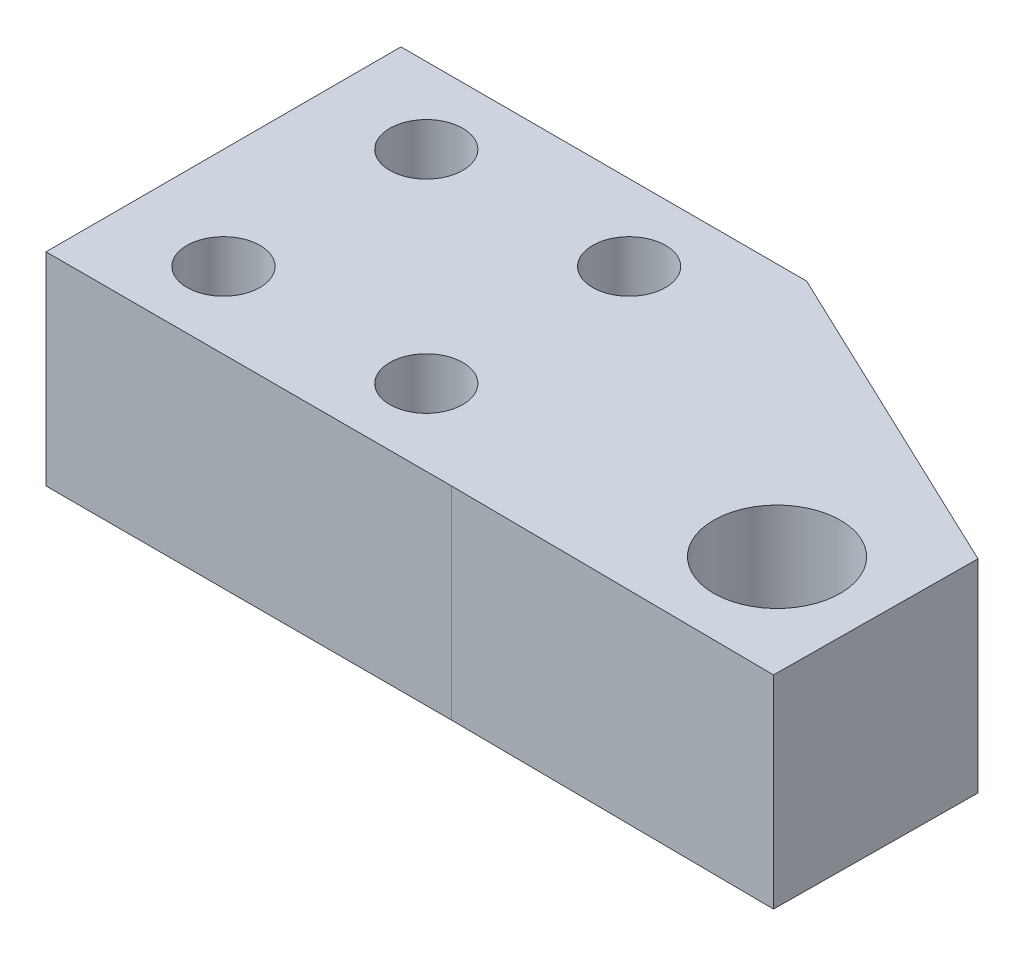
ISO-10303-21;
HEADER;
FILE_DESCRIPTION(('STEP AP214'),'2;1');
FILE_NAME('part.step','',(''),(''),'','','');
FILE_SCHEMA(('AUTOMOTIVE_DESIGN { 1 0 10303 214 1 1 1 1 }'));
ENDSEC;
DATA;
#1=APPLICATION_CONTEXT('core data for automotive mechanical design processes');
#2=APPLICATION_PROTOCOL_DEFINITION('international standard','automotive_design',2000,#1);
#3=PRODUCT_CONTEXT('',#1,'mechanical');
#4=PRODUCT('Part','Part','',(#3));
#5=PRODUCT_RELATED_PRODUCT_CATEGORY('part','',(#4));
#6=PRODUCT_DEFINITION_FORMATION('','',#4);
#7=PRODUCT_DEFINITION_CONTEXT('part definition',#1,'design');
#8=PRODUCT_DEFINITION('design','',#6,#7);
#9=PRODUCT_DEFINITION_SHAPE('','',#8);
#10=(LENGTH_UNIT() NAMED_UNIT(*) SI_UNIT(.MILLI.,.METRE.));
#11=(NAMED_UNIT(*) PLANE_ANGLE_UNIT() SI_UNIT($,.RADIAN.));
#12=(NAMED_UNIT(*) SI_UNIT($,.STERADIAN.) SOLID_ANGLE_UNIT());
#13=UNCERTAINTY_MEASURE_WITH_UNIT(LENGTH_MEASURE(1.E-05),#10,'distance_accuracy_value','');
#14=(GEOMETRIC_REPRESENTATION_CONTEXT(3) GLOBAL_UNCERTAINTY_ASSIGNED_CONTEXT((#13)) GLOBAL_UNIT_ASSIGNED_CONTEXT((#10,
#11,#12)) REPRESENTATION_CONTEXT('',''));
#15=CARTESIAN_POINT('',(0.,0.,0.));
#16=DIRECTION('',(0.,0.,1.));
#17=DIRECTION('',(1.,0.,0.));
#18=AXIS2_PLACEMENT_3D('',#15,#16,#17);
#19=CARTESIAN_POINT('',(0.,6.35,0.));
#20=DIRECTION('',(0.,1.,0.));
#21=DIRECTION('',(0.,0.,1.));
#22=AXIS2_PLACEMENT_3D('',#19,#20,#21);
#23=PLANE('',#22);
#24=CARTESIAN_POINT('',(19.05,6.35,-17.4625));
#25=DIRECTION('',(0.,1.,0.));
#26=DIRECTION('',(0.,0.,1.));
#27=AXIS2_PLACEMENT_3D('',#24,#25,#26);
#28=CIRCLE('',#27,2.286);
#29=CARTESIAN_POINT('',(19.05,6.35,-15.1765));
#30=VERTEX_POINT('',#29);
#31=EDGE_CURVE('E220',#30,#30,#28,.T.);
#32=ORIENTED_EDGE('',*,*,#31,.F.);
#33=EDGE_LOOP('',(#32));
#34=FACE_BOUND('',#33,.T.);
#35=CARTESIAN_POINT('',(19.05,6.35,-4.7625));
#36=DIRECTION('',(0.,1.,0.));
#37=DIRECTION('',(0.,0.,1.));
#38=AXIS2_PLACEMENT_3D('',#35,#36,#37);
#39=CIRCLE('',#38,2.286);
#40=CARTESIAN_POINT('',(19.05,6.35,-2.4765));
#41=VERTEX_POINT('',#40);
#42=EDGE_CURVE('E236',#41,#41,#39,.T.);
#43=ORIENTED_EDGE('',*,*,#42,.F.);
#44=EDGE_LOOP('',(#43));
#45=FACE_BOUND('',#44,.T.);
#46=DIRECTION('',(1.,0.,0.));
#47=VECTOR('',#46,1.);
#48=CARTESIAN_POINT('',(0.,6.35,0.));
#49=LINE('',#48,#47);
#50=CARTESIAN_POINT('',(0.,6.35,0.));
#51=VERTEX_POINT('',#50);
#52=CARTESIAN_POINT('',(25.4,6.35,0.));
#53=VERTEX_POINT('',#52);
#54=EDGE_CURVE('E150',#51,#53,#49,.T.);
#55=ORIENTED_EDGE('',*,*,#54,.T.);
#56=DIRECTION('',(0.999966329518516,0.,0.0082060848927775));
#57=VECTOR('',#56,1.);
#58=CARTESIAN_POINT('',(25.4,6.35,0.));
#59=LINE('',#58,#57);
#60=CARTESIAN_POINT('',(45.7193158158162,6.35,0.166747645021239));
#61=VERTEX_POINT('',#60);
#62=EDGE_CURVE('E98',#53,#61,#59,.T.);
#63=ORIENTED_EDGE('',*,*,#62,.T.);
#64=DIRECTION('',(0.0082060848927785,0.,-0.999966329518516));
#65=VECTOR('',#64,1.);
#66=CARTESIAN_POINT('',(45.8235330939545,6.35,-12.5328247398639));
#67=LINE('',#66,#65);
#68=CARTESIAN_POINT('',(45.8235330939545,6.35,-12.5328247398639));
#69=VERTEX_POINT('',#68);
#70=EDGE_CURVE('E111',#61,#69,#67,.T.);
#71=ORIENTED_EDGE('',*,*,#70,.T.);
#72=DIRECTION('',(-0.903431788503055,0.,-0.428731855035489));
#73=VECTOR('',#72,1.);
#74=CARTESIAN_POINT('',(25.4,6.35,-22.225));
#75=LINE('',#74,#73);
#76=CARTESIAN_POINT('',(25.4,6.35,-22.225));
#77=VERTEX_POINT('',#76);
#78=EDGE_CURVE('E105',#69,#77,#75,.T.);
#79=ORIENTED_EDGE('',*,*,#78,.T.);
#80=DIRECTION('',(-1.,0.,0.));
#81=VECTOR('',#80,1.);
#82=CARTESIAN_POINT('',(0.,6.35,-22.225));
#83=LINE('',#82,#81);
#84=CARTESIAN_POINT('',(0.,6.35,-22.225));
#85=VERTEX_POINT('',#84);
#86=EDGE_CURVE('E109',#77,#85,#83,.T.);
#87=ORIENTED_EDGE('',*,*,#86,.T.);
#88=DIRECTION('',(0.,0.,1.));
#89=VECTOR('',#88,1.);
#90=CARTESIAN_POINT('',(0.,6.35,0.));
#91=LINE('',#90,#89);
#92=EDGE_CURVE('E61',#85,#51,#91,.T.);
#93=ORIENTED_EDGE('',*,*,#92,.T.);
#94=EDGE_LOOP('',(#55,#63,#71,#79,#87,#93));
#95=FACE_BOUND('',#94,.T.);
#96=CARTESIAN_POINT('',(39.4225807861159,6.35,-6.35));
#97=DIRECTION('',(0.,1.,0.));
#98=DIRECTION('',(0.,0.,1.));
#99=AXIS2_PLACEMENT_3D('',#96,#97,#98);
#100=CIRCLE('',#99,3.96875);
#101=CARTESIAN_POINT('',(39.4225807861159,6.35,-2.38125));
#102=VERTEX_POINT('',#101);
#103=EDGE_CURVE('E138',#102,#102,#100,.T.);
#104=ORIENTED_EDGE('',*,*,#103,.F.);
#105=EDGE_LOOP('',(#104));
#106=FACE_BOUND('',#105,.T.);
#107=CARTESIAN_POINT('',(6.35,6.35,-4.7625));
#108=DIRECTION('',(0.,1.,0.));
#109=DIRECTION('',(0.,0.,1.));
#110=AXIS2_PLACEMENT_3D('',#107,#108,#109);
#111=CIRCLE('',#110,2.286);
#112=CARTESIAN_POINT('',(6.35,6.35,-2.4765));
#113=VERTEX_POINT('',#112);
#114=EDGE_CURVE('E228',#113,#113,#111,.T.);
#115=ORIENTED_EDGE('',*,*,#114,.F.);
#116=EDGE_LOOP('',(#115));
#117=FACE_BOUND('',#116,.T.);
#118=CARTESIAN_POINT('',(6.34999999999996,6.35,-17.4625));
#119=DIRECTION('',(0.,1.,0.));
#120=DIRECTION('',(0.,0.,1.));
#121=AXIS2_PLACEMENT_3D('',#118,#119,#120);
#122=CIRCLE('',#121,2.286);
#123=CARTESIAN_POINT('',(6.34999999999996,6.35,-15.1765));
#124=VERTEX_POINT('',#123);
#125=EDGE_CURVE('E209',#124,#124,#122,.T.);
#126=ORIENTED_EDGE('',*,*,#125,.F.);
#127=EDGE_LOOP('',(#126));
#128=FACE_BOUND('',#127,.T.);
#129=ADVANCED_FACE('F43',(#34,#45,#95,#106,#117,#128),#23,.T.);
#130=CARTESIAN_POINT('',(0.,-6.35,0.));
#131=DIRECTION('',(0.,1.,0.));
#132=DIRECTION('',(0.,0.,1.));
#133=AXIS2_PLACEMENT_3D('',#130,#131,#132);
#134=PLANE('',#133);
#135=DIRECTION('',(1.,0.,0.));
#136=VECTOR('',#135,1.);
#137=CARTESIAN_POINT('',(0.,-6.35,0.));
#138=LINE('',#137,#136);
#139=CARTESIAN_POINT('',(0.,-6.35,0.));
#140=VERTEX_POINT('',#139);
#141=CARTESIAN_POINT('',(25.4,-6.35,0.));
#142=VERTEX_POINT('',#141);
#143=EDGE_CURVE('E133',#140,#142,#138,.T.);
#144=ORIENTED_EDGE('',*,*,#143,.F.);
#145=DIRECTION('',(0.,0.,1.));
#146=VECTOR('',#145,1.);
#147=CARTESIAN_POINT('',(0.,-6.35,0.));
#148=LINE('',#147,#146);
#149=CARTESIAN_POINT('',(0.,-6.35,-22.225));
#150=VERTEX_POINT('',#149);
#151=EDGE_CURVE('E90',#150,#140,#148,.T.);
#152=ORIENTED_EDGE('',*,*,#151,.F.);
#153=DIRECTION('',(-1.,0.,0.));
#154=VECTOR('',#153,1.);
#155=CARTESIAN_POINT('',(0.,-6.35,-22.225));
#156=LINE('',#155,#154);
#157=CARTESIAN_POINT('',(25.4,-6.35,-22.225));
#158=VERTEX_POINT('',#157);
#159=EDGE_CURVE('E84',#158,#150,#156,.T.);
#160=ORIENTED_EDGE('',*,*,#159,.F.);
#161=DIRECTION('',(-0.903431788503055,0.,-0.428731855035489));
#162=VECTOR('',#161,1.);
#163=CARTESIAN_POINT('',(25.4,-6.35,-22.225));
#164=LINE('',#163,#162);
#165=CARTESIAN_POINT('',(45.8235330939545,-6.35,-12.5328247398639));
#166=VERTEX_POINT('',#165);
#167=EDGE_CURVE('E120',#166,#158,#164,.T.);
#168=ORIENTED_EDGE('',*,*,#167,.F.);
#169=DIRECTION('',(0.0082060848927785,0.,-0.999966329518516));
#170=VECTOR('',#169,1.);
#171=CARTESIAN_POINT('',(45.8235330939545,-6.35,-12.5328247398639));
#172=LINE('',#171,#170);
#173=CARTESIAN_POINT('',(45.7193158158162,-6.35,0.166747645021239));
#174=VERTEX_POINT('',#173);
#175=EDGE_CURVE('E141',#174,#166,#172,.T.);
#176=ORIENTED_EDGE('',*,*,#175,.F.);
#177=DIRECTION('',(0.999966329518516,0.,0.0082060848927775));
#178=VECTOR('',#177,1.);
#179=CARTESIAN_POINT('',(25.4,-6.35,0.));
#180=LINE('',#179,#178);
#181=EDGE_CURVE('E137',#142,#174,#180,.T.);
#182=ORIENTED_EDGE('',*,*,#181,.F.);
#183=EDGE_LOOP('',(#144,#152,#160,#168,#176,#182));
#184=FACE_BOUND('',#183,.T.);
#185=CARTESIAN_POINT('',(39.4225807861159,-6.35,-6.35));
#186=DIRECTION('',(0.,1.,0.));
#187=DIRECTION('',(0.,0.,1.));
#188=AXIS2_PLACEMENT_3D('',#185,#186,#187);
#189=CIRCLE('',#188,3.96875);
#190=CARTESIAN_POINT('',(39.4225807861159,-6.35,-2.38125));
#191=VERTEX_POINT('',#190);
#192=EDGE_CURVE('E240',#191,#191,#189,.T.);
#193=ORIENTED_EDGE('',*,*,#192,.T.);
#194=EDGE_LOOP('',(#193));
#195=FACE_BOUND('',#194,.T.);
#196=CARTESIAN_POINT('',(19.05,-6.35,-4.7625));
#197=DIRECTION('',(0.,1.,0.));
#198=DIRECTION('',(0.,0.,1.));
#199=AXIS2_PLACEMENT_3D('',#196,#197,#198);
#200=CIRCLE('',#199,2.286);
#201=CARTESIAN_POINT('',(19.05,-6.35,-2.4765));
#202=VERTEX_POINT('',#201);
#203=EDGE_CURVE('E232',#202,#202,#200,.T.);
#204=ORIENTED_EDGE('',*,*,#203,.T.);
#205=EDGE_LOOP('',(#204));
#206=FACE_BOUND('',#205,.T.);
#207=CARTESIAN_POINT('',(6.35,-6.35,-4.7625));
#208=DIRECTION('',(0.,1.,0.));
#209=DIRECTION('',(0.,0.,1.));
#210=AXIS2_PLACEMENT_3D('',#207,#208,#209);
#211=CIRCLE('',#210,2.286);
#212=CARTESIAN_POINT('',(6.35,-6.35,-2.4765));
#213=VERTEX_POINT('',#212);
#214=EDGE_CURVE('E224',#213,#213,#211,.T.);
#215=ORIENTED_EDGE('',*,*,#214,.T.);
#216=EDGE_LOOP('',(#215));
#217=FACE_BOUND('',#216,.T.);
#218=CARTESIAN_POINT('',(19.05,-6.35,-17.4625));
#219=DIRECTION('',(0.,1.,0.));
#220=DIRECTION('',(0.,0.,1.));
#221=AXIS2_PLACEMENT_3D('',#218,#219,#220);
#222=CIRCLE('',#221,2.286);
#223=CARTESIAN_POINT('',(19.05,-6.35,-15.1765));
#224=VERTEX_POINT('',#223);
#225=EDGE_CURVE('E217',#224,#224,#222,.T.);
#226=ORIENTED_EDGE('',*,*,#225,.T.);
#227=EDGE_LOOP('',(#226));
#228=FACE_BOUND('',#227,.T.);
#229=CARTESIAN_POINT('',(6.34999999999996,-6.35,-17.4625));
#230=DIRECTION('',(0.,1.,0.));
#231=DIRECTION('',(0.,0.,1.));
#232=AXIS2_PLACEMENT_3D('',#229,#230,#231);
#233=CIRCLE('',#232,2.286);
#234=CARTESIAN_POINT('',(6.34999999999996,-6.35,-15.1765));
#235=VERTEX_POINT('',#234);
#236=EDGE_CURVE('E212',#235,#235,#233,.T.);
#237=ORIENTED_EDGE('',*,*,#236,.T.);
#238=EDGE_LOOP('',(#237));
#239=FACE_BOUND('',#238,.T.);
#240=ADVANCED_FACE('F163',(#184,#195,#206,#217,#228,#239),#134,.F.);
#241=CARTESIAN_POINT('',(0.,6.35,0.));
#242=DIRECTION('',(0.,0.,-1.));
#243=DIRECTION('',(-1.,0.,0.));
#244=AXIS2_PLACEMENT_3D('',#241,#242,#243);
#245=PLANE('',#244);
#246=ORIENTED_EDGE('',*,*,#143,.T.);
#247=DIRECTION('',(0.,-1.,0.));
#248=VECTOR('',#247,1.);
#249=CARTESIAN_POINT('',(25.4,6.35,0.));
#250=LINE('',#249,#248);
#251=EDGE_CURVE('E11',#53,#142,#250,.T.);
#252=ORIENTED_EDGE('',*,*,#251,.F.);
#253=ORIENTED_EDGE('',*,*,#54,.F.);
#254=DIRECTION('',(0.,-1.,0.));
#255=VECTOR('',#254,1.);
#256=CARTESIAN_POINT('',(0.,6.35,0.));
#257=LINE('',#256,#255);
#258=EDGE_CURVE('E129',#51,#140,#257,.T.);
#259=ORIENTED_EDGE('',*,*,#258,.T.);
#260=EDGE_LOOP('',(#246,#252,#253,#259));
#261=FACE_BOUND('',#260,.T.);
#262=ADVANCED_FACE('F45',(#261),#245,.F.);
#263=CARTESIAN_POINT('',(25.4,6.35,0.));
#264=DIRECTION('',(0.0082060848927775,0.,-0.999966329518516));
#265=DIRECTION('',(-0.999966329518516,0.,-0.0082060848927775));
#266=AXIS2_PLACEMENT_3D('',#263,#264,#265);
#267=PLANE('',#266);
#268=ORIENTED_EDGE('',*,*,#181,.T.);
#269=DIRECTION('',(0.,-1.,0.));
#270=VECTOR('',#269,1.);
#271=CARTESIAN_POINT('',(45.7193158158162,6.35,0.166747645021239));
#272=LINE('',#271,#270);
#273=EDGE_CURVE('E53',#61,#174,#272,.T.);
#274=ORIENTED_EDGE('',*,*,#273,.F.);
#275=ORIENTED_EDGE('',*,*,#62,.F.);
#276=ORIENTED_EDGE('',*,*,#251,.T.);
#277=EDGE_LOOP('',(#268,#274,#275,#276));
#278=FACE_BOUND('',#277,.T.);
#279=ADVANCED_FACE('F317',(#278),#267,.F.);
#280=CARTESIAN_POINT('',(45.8235330939545,6.35,-12.5328247398639));
#281=DIRECTION('',(-0.999966329518516,0.,-0.0082060848927785));
#282=DIRECTION('',(-0.0082060848927785,0.,0.999966329518516));
#283=AXIS2_PLACEMENT_3D('',#280,#281,#282);
#284=PLANE('',#283);
#285=ORIENTED_EDGE('',*,*,#175,.T.);
#286=DIRECTION('',(0.,-1.,0.));
#287=VECTOR('',#286,1.);
#288=CARTESIAN_POINT('',(45.8235330939545,6.35,-12.5328247398639));
#289=LINE('',#288,#287);
#290=EDGE_CURVE('E122',#69,#166,#289,.T.);
#291=ORIENTED_EDGE('',*,*,#290,.F.);
#292=ORIENTED_EDGE('',*,*,#70,.F.);
#293=ORIENTED_EDGE('',*,*,#273,.T.);
#294=EDGE_LOOP('',(#285,#291,#292,#293));
#295=FACE_BOUND('',#294,.T.);
#296=ADVANCED_FACE('F160',(#295),#284,.F.);
#297=CARTESIAN_POINT('',(25.4,6.35,-22.225));
#298=DIRECTION('',(-0.428731855035489,0.,0.903431788503055));
#299=DIRECTION('',(0.903431788503055,0.,0.428731855035489));
#300=AXIS2_PLACEMENT_3D('',#297,#298,#299);
#301=PLANE('',#300);
#302=ORIENTED_EDGE('',*,*,#167,.T.);
#303=DIRECTION('',(0.,-1.,0.));
#304=VECTOR('',#303,1.);
#305=CARTESIAN_POINT('',(25.4,6.35,-22.225));
#306=LINE('',#305,#304);
#307=EDGE_CURVE('E117',#77,#158,#306,.T.);
#308=ORIENTED_EDGE('',*,*,#307,.F.);
#309=ORIENTED_EDGE('',*,*,#78,.F.);
#310=ORIENTED_EDGE('',*,*,#290,.T.);
#311=EDGE_LOOP('',(#302,#308,#309,#310));
#312=FACE_BOUND('',#311,.T.);
#313=ADVANCED_FACE('F118',(#312),#301,.F.);
#314=CARTESIAN_POINT('',(0.,6.35,-22.225));
#315=DIRECTION('',(0.,0.,1.));
#316=DIRECTION('',(1.,0.,0.));
#317=AXIS2_PLACEMENT_3D('',#314,#315,#316);
#318=PLANE('',#317);
#319=ORIENTED_EDGE('',*,*,#159,.T.);
#320=DIRECTION('',(0.,-1.,0.));
#321=VECTOR('',#320,1.);
#322=CARTESIAN_POINT('',(0.,6.35,-22.225));
#323=LINE('',#322,#321);
#324=EDGE_CURVE('E123',#85,#150,#323,.T.);
#325=ORIENTED_EDGE('',*,*,#324,.F.);
#326=ORIENTED_EDGE('',*,*,#86,.F.);
#327=ORIENTED_EDGE('',*,*,#307,.T.);
#328=EDGE_LOOP('',(#319,#325,#326,#327));
#329=FACE_BOUND('',#328,.T.);
#330=ADVANCED_FACE('F125',(#329),#318,.F.);
#331=CARTESIAN_POINT('',(0.,6.35,0.));
#332=DIRECTION('',(1.,0.,0.));
#333=DIRECTION('',(0.,0.,-1.));
#334=AXIS2_PLACEMENT_3D('',#331,#332,#333);
#335=PLANE('',#334);
#336=ORIENTED_EDGE('',*,*,#151,.T.);
#337=ORIENTED_EDGE('',*,*,#258,.F.);
#338=ORIENTED_EDGE('',*,*,#92,.F.);
#339=ORIENTED_EDGE('',*,*,#324,.T.);
#340=EDGE_LOOP('',(#336,#337,#338,#339));
#341=FACE_BOUND('',#340,.T.);
#342=ADVANCED_FACE('F168',(#341),#335,.F.);
#343=CARTESIAN_POINT('',(39.4225807861159,6.35,-6.35));
#344=DIRECTION('',(0.,-1.,0.));
#345=DIRECTION('',(0.,0.,-1.));
#346=AXIS2_PLACEMENT_3D('',#343,#344,#345);
#347=CYLINDRICAL_SURFACE('',#346,3.96875);
#348=ORIENTED_EDGE('',*,*,#103,.T.);
#349=EDGE_LOOP('',(#348));
#350=FACE_BOUND('',#349,.T.);
#351=ORIENTED_EDGE('',*,*,#192,.F.);
#352=EDGE_LOOP('',(#351));
#353=FACE_BOUND('',#352,.T.);
#354=ADVANCED_FACE('F170',(#350,#353),#347,.F.);
#355=CARTESIAN_POINT('',(19.05,6.35,-4.7625));
#356=DIRECTION('',(0.,-1.,0.));
#357=DIRECTION('',(0.,0.,-1.));
#358=AXIS2_PLACEMENT_3D('',#355,#356,#357);
#359=CYLINDRICAL_SURFACE('',#358,2.286);
#360=ORIENTED_EDGE('',*,*,#42,.T.);
#361=EDGE_LOOP('',(#360));
#362=FACE_BOUND('',#361,.T.);
#363=ORIENTED_EDGE('',*,*,#203,.F.);
#364=EDGE_LOOP('',(#363));
#365=FACE_BOUND('',#364,.T.);
#366=ADVANCED_FACE('F176',(#362,#365),#359,.F.);
#367=CARTESIAN_POINT('',(6.35,6.35,-4.7625));
#368=DIRECTION('',(0.,-1.,0.));
#369=DIRECTION('',(0.,0.,-1.));
#370=AXIS2_PLACEMENT_3D('',#367,#368,#369);
#371=CYLINDRICAL_SURFACE('',#370,2.286);
#372=ORIENTED_EDGE('',*,*,#114,.T.);
#373=EDGE_LOOP('',(#372));
#374=FACE_BOUND('',#373,.T.);
#375=ORIENTED_EDGE('',*,*,#214,.F.);
#376=EDGE_LOOP('',(#375));
#377=FACE_BOUND('',#376,.T.);
#378=ADVANCED_FACE('F192',(#374,#377),#371,.F.);
#379=CARTESIAN_POINT('',(19.05,6.35,-17.4625));
#380=DIRECTION('',(0.,-1.,0.));
#381=DIRECTION('',(0.,0.,-1.));
#382=AXIS2_PLACEMENT_3D('',#379,#380,#381);
#383=CYLINDRICAL_SURFACE('',#382,2.286);
#384=ORIENTED_EDGE('',*,*,#31,.T.);
#385=EDGE_LOOP('',(#384));
#386=FACE_BOUND('',#385,.T.);
#387=ORIENTED_EDGE('',*,*,#225,.F.);
#388=EDGE_LOOP('',(#387));
#389=FACE_BOUND('',#388,.T.);
#390=ADVANCED_FACE('F196',(#386,#389),#383,.F.);
#391=CARTESIAN_POINT('',(6.34999999999996,6.35,-17.4625));
#392=DIRECTION('',(0.,-1.,0.));
#393=DIRECTION('',(0.,0.,-1.));
#394=AXIS2_PLACEMENT_3D('',#391,#392,#393);
#395=CYLINDRICAL_SURFACE('',#394,2.286);
#396=ORIENTED_EDGE('',*,*,#125,.T.);
#397=EDGE_LOOP('',(#396));
#398=FACE_BOUND('',#397,.T.);
#399=ORIENTED_EDGE('',*,*,#236,.F.);
#400=EDGE_LOOP('',(#399));
#401=FACE_BOUND('',#400,.T.);
#402=ADVANCED_FACE('F200',(#398,#401),#395,.F.);
#403=CLOSED_SHELL('',(#129,#240,#262,#279,#296,#313,#330,#342,#354,#366,#378,#390,#402));
#404=MANIFOLD_SOLID_BREP('B2',#403);
#405=ADVANCED_BREP_SHAPE_REPRESENTATION('',(#18,#404),#14);
#406=SHAPE_DEFINITION_REPRESENTATION(#9,#405);
ENDSEC;
END-ISO-10303-21;
